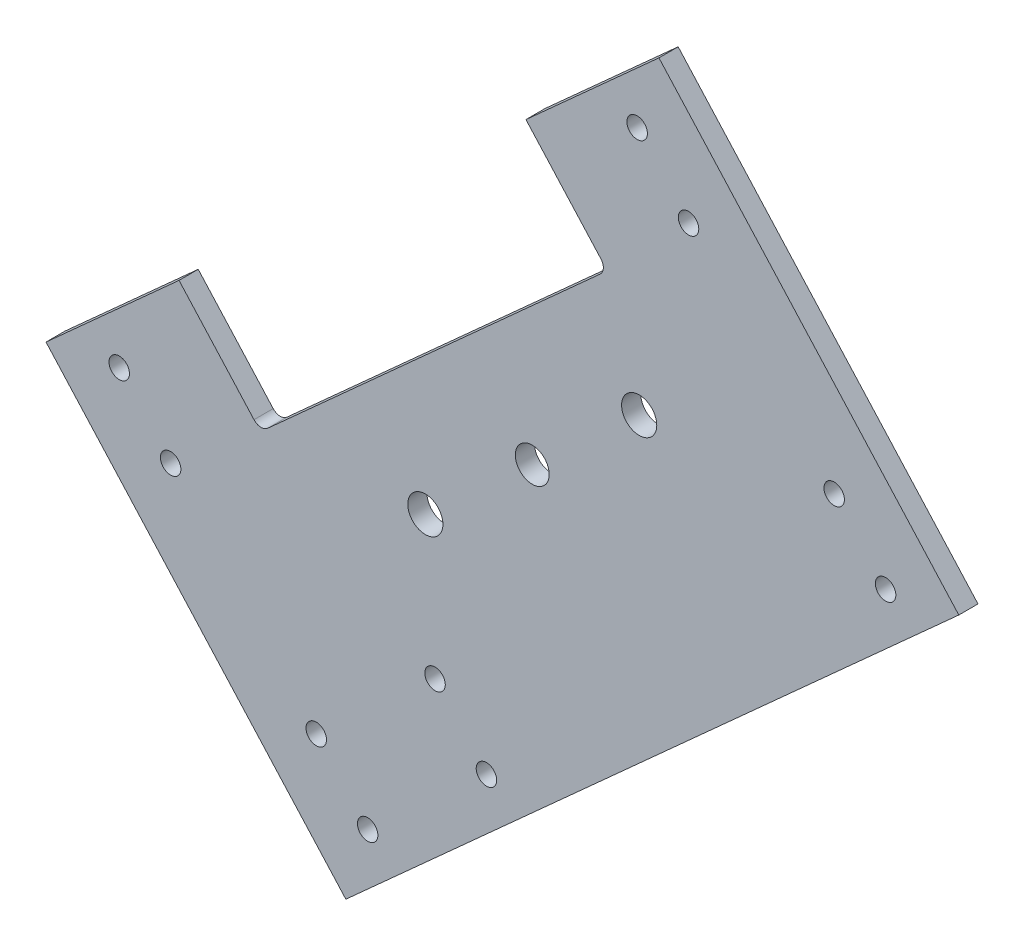
ISO-10303-21;
HEADER;
FILE_DESCRIPTION(('STEP AP214'),'2;1');
FILE_NAME('part.step','',(''),(''),'','','');
FILE_SCHEMA(('AUTOMOTIVE_DESIGN { 1 0 10303 214 1 1 1 1 }'));
ENDSEC;
DATA;
#1=APPLICATION_CONTEXT('core data for automotive mechanical design processes');
#2=APPLICATION_PROTOCOL_DEFINITION('international standard','automotive_design',2000,#1);
#3=PRODUCT_CONTEXT('',#1,'mechanical');
#4=PRODUCT('Part','Part','',(#3));
#5=PRODUCT_RELATED_PRODUCT_CATEGORY('part','',(#4));
#6=PRODUCT_DEFINITION_FORMATION('','',#4);
#7=PRODUCT_DEFINITION_CONTEXT('part definition',#1,'design');
#8=PRODUCT_DEFINITION('design','',#6,#7);
#9=PRODUCT_DEFINITION_SHAPE('','',#8);
#10=(LENGTH_UNIT() NAMED_UNIT(*) SI_UNIT(.MILLI.,.METRE.));
#11=(NAMED_UNIT(*) PLANE_ANGLE_UNIT() SI_UNIT($,.RADIAN.));
#12=(NAMED_UNIT(*) SI_UNIT($,.STERADIAN.) SOLID_ANGLE_UNIT());
#13=UNCERTAINTY_MEASURE_WITH_UNIT(LENGTH_MEASURE(1.E-05),#10,'distance_accuracy_value','');
#14=(GEOMETRIC_REPRESENTATION_CONTEXT(3) GLOBAL_UNCERTAINTY_ASSIGNED_CONTEXT((#13)) GLOBAL_UNIT_ASSIGNED_CONTEXT((#10,
#11,#12)) REPRESENTATION_CONTEXT('',''));
#15=CARTESIAN_POINT('',(0.,0.,0.));
#16=DIRECTION('',(0.,0.,1.));
#17=DIRECTION('',(1.,0.,0.));
#18=AXIS2_PLACEMENT_3D('',#15,#16,#17);
#19=CARTESIAN_POINT('',(59.4886804559392,-390.039209499829,3.));
#20=DIRECTION('',(0.669590345856137,-0.742730616533517,0.));
#21=DIRECTION('',(0.742730616533517,0.669590345856137,0.));
#22=AXIS2_PLACEMENT_3D('',#19,#20,#21);
#23=PLANE('',#22);
#24=DIRECTION('',(-0.742730616533517,-0.669590345856137,0.));
#25=VECTOR('',#24,1.);
#26=CARTESIAN_POINT('',(59.4886804559392,-390.039209499829,3.));
#27=LINE('',#26,#25);
#28=CARTESIAN_POINT('',(80.2851377188777,-371.290679815857,3.));
#29=VERTEX_POINT('',#28);
#30=CARTESIAN_POINT('',(59.4886804559392,-390.039209499829,3.));
#31=VERTEX_POINT('',#30);
#32=EDGE_CURVE('E88',#29,#31,#27,.T.);
#33=ORIENTED_EDGE('',*,*,#32,.F.);
#34=DIRECTION('',(0.,0.,1.));
#35=VECTOR('',#34,1.);
#36=CARTESIAN_POINT('',(80.2851377188777,-371.290679815857,0.));
#37=LINE('',#36,#35);
#38=CARTESIAN_POINT('',(80.2851377188777,-371.290679815857,0.));
#39=VERTEX_POINT('',#38);
#40=EDGE_CURVE('E168',#39,#29,#37,.T.);
#41=ORIENTED_EDGE('',*,*,#40,.F.);
#42=DIRECTION('',(-0.742730616533517,-0.669590345856137,0.));
#43=VECTOR('',#42,1.);
#44=CARTESIAN_POINT('',(59.4886804559392,-390.039209499829,0.));
#45=LINE('',#44,#43);
#46=CARTESIAN_POINT('',(59.4886804559392,-390.039209499829,0.));
#47=VERTEX_POINT('',#46);
#48=EDGE_CURVE('E144',#39,#47,#45,.T.);
#49=ORIENTED_EDGE('',*,*,#48,.T.);
#50=DIRECTION('',(0.,0.,-1.));
#51=VECTOR('',#50,1.);
#52=CARTESIAN_POINT('',(59.4886804559392,-390.039209499829,3.));
#53=LINE('',#52,#51);
#54=EDGE_CURVE('E11',#31,#47,#53,.T.);
#55=ORIENTED_EDGE('',*,*,#54,.F.);
#56=EDGE_LOOP('',(#33,#41,#49,#55));
#57=FACE_BOUND('',#56,.T.);
#58=ADVANCED_FACE('F35',(#57),#23,.F.);
#59=CARTESIAN_POINT('',(155.305831868034,-303.657635716841,0.));
#60=VERTEX_POINT('',#59);
#61=CARTESIAN_POINT('',(134.509374605096,-322.406165400813,0.));
#62=VERTEX_POINT('',#61);
#63=EDGE_CURVE('E251',#60,#62,#45,.T.);
#64=ORIENTED_EDGE('',*,*,#63,.T.);
#65=DIRECTION('',(0.,0.,1.));
#66=VECTOR('',#65,1.);
#67=CARTESIAN_POINT('',(134.509374605096,-322.406165400813,0.));
#68=LINE('',#67,#66);
#69=CARTESIAN_POINT('',(134.509374605096,-322.406165400813,3.));
#70=VERTEX_POINT('',#69);
#71=EDGE_CURVE('E171',#62,#70,#68,.T.);
#72=ORIENTED_EDGE('',*,*,#71,.T.);
#73=CARTESIAN_POINT('',(155.305831868034,-303.657635716841,3.));
#74=VERTEX_POINT('',#73);
#75=EDGE_CURVE('E243',#74,#70,#27,.T.);
#76=ORIENTED_EDGE('',*,*,#75,.F.);
#77=DIRECTION('',(0.,0.,-1.));
#78=VECTOR('',#77,1.);
#79=CARTESIAN_POINT('',(155.305831868034,-303.657635716841,3.));
#80=LINE('',#79,#78);
#81=EDGE_CURVE('E250',#74,#60,#80,.T.);
#82=ORIENTED_EDGE('',*,*,#81,.T.);
#83=EDGE_LOOP('',(#64,#72,#76,#82));
#84=FACE_BOUND('',#83,.T.);
#85=ADVANCED_FACE('F37',(#84),#23,.F.);
#86=CARTESIAN_POINT('',(106.360004665869,-442.030352657175,3.));
#87=DIRECTION('',(0.742730616533512,0.669590345856143,0.));
#88=DIRECTION('',(-0.669590345856143,0.742730616533512,0.));
#89=AXIS2_PLACEMENT_3D('',#86,#87,#88);
#90=PLANE('',#89);
#91=DIRECTION('',(0.669590345856143,-0.742730616533512,0.));
#92=VECTOR('',#91,1.);
#93=CARTESIAN_POINT('',(106.360004665869,-442.030352657175,0.));
#94=LINE('',#93,#92);
#95=CARTESIAN_POINT('',(106.360004665869,-442.030352657175,0.));
#96=VERTEX_POINT('',#95);
#97=EDGE_CURVE('E254',#47,#96,#94,.T.);
#98=ORIENTED_EDGE('',*,*,#97,.T.);
#99=DIRECTION('',(0.,0.,-1.));
#100=VECTOR('',#99,1.);
#101=CARTESIAN_POINT('',(106.360004665869,-442.030352657175,3.));
#102=LINE('',#101,#100);
#103=CARTESIAN_POINT('',(106.360004665869,-442.030352657175,3.));
#104=VERTEX_POINT('',#103);
#105=EDGE_CURVE('E44',#104,#96,#102,.T.);
#106=ORIENTED_EDGE('',*,*,#105,.F.);
#107=DIRECTION('',(0.669590345856143,-0.742730616533512,0.));
#108=VECTOR('',#107,1.);
#109=CARTESIAN_POINT('',(106.360004665869,-442.030352657175,3.));
#110=LINE('',#109,#108);
#111=EDGE_CURVE('E245',#31,#104,#110,.T.);
#112=ORIENTED_EDGE('',*,*,#111,.F.);
#113=ORIENTED_EDGE('',*,*,#54,.T.);
#114=EDGE_LOOP('',(#98,#106,#112,#113));
#115=FACE_BOUND('',#114,.T.);
#116=ADVANCED_FACE('F284',(#115),#90,.F.);
#117=CARTESIAN_POINT('',(202.177156077964,-355.648778874187,3.));
#118=DIRECTION('',(-0.669590345856137,0.742730616533518,0.));
#119=DIRECTION('',(-0.742730616533518,-0.669590345856137,0.));
#120=AXIS2_PLACEMENT_3D('',#117,#118,#119);
#121=PLANE('',#120);
#122=DIRECTION('',(0.742730616533518,0.669590345856137,0.));
#123=VECTOR('',#122,1.);
#124=CARTESIAN_POINT('',(202.177156077964,-355.648778874187,0.));
#125=LINE('',#124,#123);
#126=CARTESIAN_POINT('',(202.177156077964,-355.648778874187,0.));
#127=VERTEX_POINT('',#126);
#128=EDGE_CURVE('E256',#96,#127,#125,.T.);
#129=ORIENTED_EDGE('',*,*,#128,.T.);
#130=DIRECTION('',(0.,0.,-1.));
#131=VECTOR('',#130,1.);
#132=CARTESIAN_POINT('',(202.177156077964,-355.648778874187,3.));
#133=LINE('',#132,#131);
#134=CARTESIAN_POINT('',(202.177156077964,-355.648778874187,3.));
#135=VERTEX_POINT('',#134);
#136=EDGE_CURVE('E260',#135,#127,#133,.T.);
#137=ORIENTED_EDGE('',*,*,#136,.F.);
#138=DIRECTION('',(0.742730616533518,0.669590345856137,0.));
#139=VECTOR('',#138,1.);
#140=CARTESIAN_POINT('',(202.177156077964,-355.648778874187,3.));
#141=LINE('',#140,#139);
#142=EDGE_CURVE('E247',#104,#135,#141,.T.);
#143=ORIENTED_EDGE('',*,*,#142,.F.);
#144=ORIENTED_EDGE('',*,*,#105,.T.);
#145=EDGE_LOOP('',(#129,#137,#143,#144));
#146=FACE_BOUND('',#145,.T.);
#147=ADVANCED_FACE('F267',(#146),#121,.F.);
#148=CARTESIAN_POINT('',(155.305831868034,-303.657635716841,3.));
#149=DIRECTION('',(-0.742730616533512,-0.669590345856143,0.));
#150=DIRECTION('',(0.669590345856143,-0.742730616533512,0.));
#151=AXIS2_PLACEMENT_3D('',#148,#149,#150);
#152=PLANE('',#151);
#153=DIRECTION('',(-0.669590345856143,0.742730616533512,0.));
#154=VECTOR('',#153,1.);
#155=CARTESIAN_POINT('',(155.305831868034,-303.657635716841,0.));
#156=LINE('',#155,#154);
#157=EDGE_CURVE('E81',#127,#60,#156,.T.);
#158=ORIENTED_EDGE('',*,*,#157,.T.);
#159=ORIENTED_EDGE('',*,*,#81,.F.);
#160=DIRECTION('',(-0.669590345856143,0.742730616533512,0.));
#161=VECTOR('',#160,1.);
#162=CARTESIAN_POINT('',(155.305831868034,-303.657635716841,3.));
#163=LINE('',#162,#161);
#164=EDGE_CURVE('E60',#135,#74,#163,.T.);
#165=ORIENTED_EDGE('',*,*,#164,.F.);
#166=ORIENTED_EDGE('',*,*,#136,.T.);
#167=EDGE_LOOP('',(#158,#159,#165,#166));
#168=FACE_BOUND('',#167,.T.);
#169=ADVANCED_FACE('F274',(#168),#152,.F.);
#170=CARTESIAN_POINT('',(0.,0.,3.));
#171=DIRECTION('',(0.,0.,-1.));
#172=DIRECTION('',(-1.,0.,0.));
#173=AXIS2_PLACEMENT_3D('',#170,#171,#172);
#174=PLANE('',#173);
#175=CARTESIAN_POINT('',(151.896067777836,-314.809922874602,3.));
#176=DIRECTION('',(0.,0.,1.));
#177=DIRECTION('',(1.,0.,0.));
#178=AXIS2_PLACEMENT_3D('',#175,#176,#177);
#179=CIRCLE('',#178,1.60000000001453);
#180=CARTESIAN_POINT('',(153.49606777785,-314.809922874602,3.));
#181=VERTEX_POINT('',#180);
#182=EDGE_CURVE('E194',#181,#181,#179,.T.);
#183=ORIENTED_EDGE('',*,*,#182,.F.);
#184=EDGE_LOOP('',(#183));
#185=FACE_BOUND('',#184,.T.);
#186=CARTESIAN_POINT('',(109.769768756069,-430.878065499412,3.));
#187=DIRECTION('',(0.,0.,1.));
#188=DIRECTION('',(1.,0.,0.));
#189=AXIS2_PLACEMENT_3D('',#186,#187,#188);
#190=CIRCLE('',#189,1.60000000013352);
#191=CARTESIAN_POINT('',(111.369768756202,-430.878065499412,3.));
#192=VERTEX_POINT('',#191);
#193=EDGE_CURVE('E183',#192,#192,#190,.T.);
#194=ORIENTED_EDGE('',*,*,#193,.F.);
#195=EDGE_LOOP('',(#194));
#196=FACE_BOUND('',#195,.T.);
#197=CARTESIAN_POINT('',(152.21115635042,-353.570974449494,3.));
#198=DIRECTION('',(0.,0.,1.));
#199=DIRECTION('',(1.,0.,0.));
#200=AXIS2_PLACEMENT_3D('',#197,#198,#199);
#201=CIRCLE('',#200,2.75000000000001);
#202=CARTESIAN_POINT('',(154.96115635042,-353.570974449494,3.));
#203=VERTEX_POINT('',#202);
#204=EDGE_CURVE('E170',#203,#203,#201,.T.);
#205=ORIENTED_EDGE('',*,*,#204,.F.);
#206=EDGE_LOOP('',(#205));
#207=FACE_BOUND('',#206,.T.);
#208=CARTESIAN_POINT('',(118.788278606412,-383.70254001302,3.));
#209=DIRECTION('',(0.,0.,1.));
#210=DIRECTION('',(1.,0.,0.));
#211=AXIS2_PLACEMENT_3D('',#208,#209,#210);
#212=CIRCLE('',#211,2.75000000000001);
#213=CARTESIAN_POINT('',(121.538278606412,-383.70254001302,3.));
#214=VERTEX_POINT('',#213);
#215=EDGE_CURVE('E150',#214,#214,#212,.T.);
#216=ORIENTED_EDGE('',*,*,#215,.F.);
#217=EDGE_LOOP('',(#216));
#218=FACE_BOUND('',#217,.T.);
#219=CARTESIAN_POINT('',(101.734684605795,-421.965298101009,3.));
#220=DIRECTION('',(0.,0.,1.));
#221=DIRECTION('',(1.,0.,0.));
#222=AXIS2_PLACEMENT_3D('',#219,#220,#221);
#223=CIRCLE('',#222,1.60000000013351);
#224=CARTESIAN_POINT('',(103.334684605928,-421.965298101009,3.));
#225=VERTEX_POINT('',#224);
#226=EDGE_CURVE('E182',#225,#225,#223,.T.);
#227=ORIENTED_EDGE('',*,*,#226,.F.);
#228=EDGE_LOOP('',(#227));
#229=FACE_BOUND('',#228,.T.);
#230=CARTESIAN_POINT('',(128.338034169404,-414.13830685301,3.));
#231=DIRECTION('',(0.,0.,1.));
#232=DIRECTION('',(1.,0.,0.));
#233=AXIS2_PLACEMENT_3D('',#230,#231,#232);
#234=CIRCLE('',#233,1.5999999998559);
#235=CARTESIAN_POINT('',(129.93803416926,-414.13830685301,3.));
#236=VERTEX_POINT('',#235);
#237=EDGE_CURVE('E231',#236,#236,#234,.T.);
#238=ORIENTED_EDGE('',*,*,#237,.F.);
#239=EDGE_LOOP('',(#238));
#240=FACE_BOUND('',#239,.T.);
#241=CARTESIAN_POINT('',(120.30295001913,-405.225539454608,3.));
#242=DIRECTION('',(0.,0.,1.));
#243=DIRECTION('',(1.,0.,0.));
#244=AXIS2_PLACEMENT_3D('',#241,#242,#243);
#245=CIRCLE('',#244,1.59999999985592);
#246=CARTESIAN_POINT('',(121.902950018986,-405.225539454608,3.));
#247=VERTEX_POINT('',#246);
#248=EDGE_CURVE('E225',#247,#247,#245,.T.);
#249=ORIENTED_EDGE('',*,*,#248,.F.);
#250=EDGE_LOOP('',(#249));
#251=FACE_BOUND('',#250,.T.);
#252=CARTESIAN_POINT('',(78.968612846686,-396.71245713887,3.));
#253=DIRECTION('',(0.,0.,1.));
#254=DIRECTION('',(1.,0.,0.));
#255=AXIS2_PLACEMENT_3D('',#252,#253,#254);
#256=CIRCLE('',#255,1.60000000011858);
#257=CARTESIAN_POINT('',(80.5686128468046,-396.71245713887,3.));
#258=VERTEX_POINT('',#257);
#259=EDGE_CURVE('E219',#258,#258,#256,.T.);
#260=ORIENTED_EDGE('',*,*,#259,.F.);
#261=EDGE_LOOP('',(#260));
#262=FACE_BOUND('',#261,.T.);
#263=CARTESIAN_POINT('',(70.9335286964123,-387.799689740468,3.));
#264=DIRECTION('',(0.,0.,1.));
#265=DIRECTION('',(1.,0.,0.));
#266=AXIS2_PLACEMENT_3D('',#263,#264,#265);
#267=CIRCLE('',#266,1.60000000011862);
#268=CARTESIAN_POINT('',(72.5335286965309,-387.799689740468,3.));
#269=VERTEX_POINT('',#268);
#270=EDGE_CURVE('E213',#269,#269,#267,.T.);
#271=ORIENTED_EDGE('',*,*,#270,.F.);
#272=EDGE_LOOP('',(#271));
#273=FACE_BOUND('',#272,.T.);
#274=CARTESIAN_POINT('',(190.732307837492,-357.888298633546,3.));
#275=DIRECTION('',(0.,0.,1.));
#276=DIRECTION('',(1.,0.,0.));
#277=AXIS2_PLACEMENT_3D('',#274,#275,#276);
#278=CIRCLE('',#277,1.60000000002582);
#279=CARTESIAN_POINT('',(192.332307837518,-357.888298633546,3.));
#280=VERTEX_POINT('',#279);
#281=EDGE_CURVE('E207',#280,#280,#278,.T.);
#282=ORIENTED_EDGE('',*,*,#281,.F.);
#283=EDGE_LOOP('',(#282));
#284=FACE_BOUND('',#283,.T.);
#285=CARTESIAN_POINT('',(182.697223687218,-348.975531235144,3.));
#286=DIRECTION('',(0.,0.,1.));
#287=DIRECTION('',(1.,0.,0.));
#288=AXIS2_PLACEMENT_3D('',#285,#286,#287);
#289=CIRCLE('',#288,1.60000000002582);
#290=CARTESIAN_POINT('',(184.297223687244,-348.975531235144,3.));
#291=VERTEX_POINT('',#290);
#292=EDGE_CURVE('E201',#291,#291,#289,.T.);
#293=ORIENTED_EDGE('',*,*,#292,.F.);
#294=EDGE_LOOP('',(#293));
#295=FACE_BOUND('',#294,.T.);
#296=CARTESIAN_POINT('',(159.93115192811,-323.722690273004,3.));
#297=DIRECTION('',(0.,0.,1.));
#298=DIRECTION('',(1.,0.,0.));
#299=AXIS2_PLACEMENT_3D('',#296,#297,#298);
#300=CIRCLE('',#299,1.60000000001457);
#301=CARTESIAN_POINT('',(161.531151928124,-323.722690273004,3.));
#302=VERTEX_POINT('',#301);
#303=EDGE_CURVE('E195',#302,#302,#300,.T.);
#304=ORIENTED_EDGE('',*,*,#303,.F.);
#305=EDGE_LOOP('',(#304));
#306=FACE_BOUND('',#305,.T.);
#307=CARTESIAN_POINT('',(135.499717478417,-368.636757231257,3.));
#308=DIRECTION('',(0.,0.,1.));
#309=DIRECTION('',(1.,0.,0.));
#310=AXIS2_PLACEMENT_3D('',#307,#308,#309);
#311=CIRCLE('',#310,2.65000000000002);
#312=CARTESIAN_POINT('',(138.149717478417,-368.636757231257,3.));
#313=VERTEX_POINT('',#312);
#314=EDGE_CURVE('E239',#313,#313,#311,.T.);
#315=ORIENTED_EDGE('',*,*,#314,.F.);
#316=EDGE_LOOP('',(#315));
#317=FACE_BOUND('',#316,.T.);
#318=CARTESIAN_POINT('',(93.1170646961605,-383.284080086409,3.));
#319=DIRECTION('',(0.,0.,1.));
#320=DIRECTION('',(1.,0.,0.));
#321=AXIS2_PLACEMENT_3D('',#318,#319,#320);
#322=CIRCLE('',#321,1.50000000000003);
#323=CARTESIAN_POINT('',(92.0029687713602,-384.288465605194,3.));
#324=VERTEX_POINT('',#323);
#325=CARTESIAN_POINT('',(94.1214502149448,-384.39817601121,3.));
#326=VERTEX_POINT('',#325);
#327=EDGE_CURVE('E160',#324,#326,#322,.T.);
#328=ORIENTED_EDGE('',*,*,#327,.F.);
#329=DIRECTION('',(0.669590345856143,-0.742730616533512,0.));
#330=VECTOR('',#329,1.);
#331=CARTESIAN_POINT('',(80.2851377188777,-371.290679815857,3.));
#332=LINE('',#331,#330);
#333=EDGE_CURVE('E128',#29,#324,#332,.T.);
#334=ORIENTED_EDGE('',*,*,#333,.F.);
#335=ORIENTED_EDGE('',*,*,#32,.T.);
#336=ORIENTED_EDGE('',*,*,#111,.T.);
#337=ORIENTED_EDGE('',*,*,#142,.T.);
#338=ORIENTED_EDGE('',*,*,#164,.T.);
#339=ORIENTED_EDGE('',*,*,#75,.T.);
#340=DIRECTION('',(-0.669590345856144,0.742730616533511,0.));
#341=VECTOR('',#340,1.);
#342=CARTESIAN_POINT('',(134.509374605096,-322.406165400813,3.));
#343=LINE('',#342,#341);
#344=CARTESIAN_POINT('',(146.227205657578,-335.403951190148,3.));
#345=VERTEX_POINT('',#344);
#346=EDGE_CURVE('E145',#345,#70,#343,.T.);
#347=ORIENTED_EDGE('',*,*,#346,.F.);
#348=CARTESIAN_POINT('',(145.113109732778,-336.408336708933,3.));
#349=DIRECTION('',(0.,0.,1.));
#350=DIRECTION('',(-1.,0.,0.));
#351=AXIS2_PLACEMENT_3D('',#348,#349,#350);
#352=CIRCLE('',#351,1.50000000000002);
#353=CARTESIAN_POINT('',(146.117495251562,-337.522432633733,3.));
#354=VERTEX_POINT('',#353);
#355=EDGE_CURVE('E147',#354,#345,#352,.T.);
#356=ORIENTED_EDGE('',*,*,#355,.F.);
#357=DIRECTION('',(0.742730616533512,0.669590345856143,0.));
#358=VECTOR('',#357,1.);
#359=CARTESIAN_POINT('',(94.1214502149448,-384.39817601121,3.));
#360=LINE('',#359,#358);
#361=EDGE_CURVE('E163',#326,#354,#360,.T.);
#362=ORIENTED_EDGE('',*,*,#361,.F.);
#363=EDGE_LOOP('',(#328,#334,#335,#336,#337,#338,#339,#347,#356,#362));
#364=FACE_BOUND('',#363,.T.);
#365=ADVANCED_FACE('F276',(#185,#196,#207,#218,#229,#240,#251,#262,#273,#284,#295,#306,#317,
#364),#174,.F.);
#366=CARTESIAN_POINT('',(0.,0.,0.));
#367=DIRECTION('',(0.,0.,-1.));
#368=DIRECTION('',(-1.,0.,0.));
#369=AXIS2_PLACEMENT_3D('',#366,#367,#368);
#370=PLANE('',#369);
#371=CARTESIAN_POINT('',(151.896067777836,-314.809922874602,0.));
#372=DIRECTION('',(0.,0.,1.));
#373=DIRECTION('',(1.,0.,0.));
#374=AXIS2_PLACEMENT_3D('',#371,#372,#373);
#375=CIRCLE('',#374,1.60000000001453);
#376=CARTESIAN_POINT('',(153.49606777785,-314.809922874602,0.));
#377=VERTEX_POINT('',#376);
#378=EDGE_CURVE('E242',#377,#377,#375,.T.);
#379=ORIENTED_EDGE('',*,*,#378,.T.);
#380=EDGE_LOOP('',(#379));
#381=FACE_BOUND('',#380,.T.);
#382=CARTESIAN_POINT('',(109.769768756069,-430.878065499412,0.));
#383=DIRECTION('',(0.,0.,1.));
#384=DIRECTION('',(1.,0.,0.));
#385=AXIS2_PLACEMENT_3D('',#382,#383,#384);
#386=CIRCLE('',#385,1.60000000013352);
#387=CARTESIAN_POINT('',(111.369768756202,-430.878065499412,0.));
#388=VERTEX_POINT('',#387);
#389=EDGE_CURVE('E179',#388,#388,#386,.T.);
#390=ORIENTED_EDGE('',*,*,#389,.T.);
#391=EDGE_LOOP('',(#390));
#392=FACE_BOUND('',#391,.T.);
#393=CARTESIAN_POINT('',(152.21115635042,-353.570974449494,0.));
#394=DIRECTION('',(0.,0.,1.));
#395=DIRECTION('',(1.,0.,0.));
#396=AXIS2_PLACEMENT_3D('',#393,#394,#395);
#397=CIRCLE('',#396,2.75000000000001);
#398=CARTESIAN_POINT('',(154.96115635042,-353.570974449494,0.));
#399=VERTEX_POINT('',#398);
#400=EDGE_CURVE('E186',#399,#399,#397,.T.);
#401=ORIENTED_EDGE('',*,*,#400,.T.);
#402=EDGE_LOOP('',(#401));
#403=FACE_BOUND('',#402,.T.);
#404=CARTESIAN_POINT('',(118.788278606412,-383.70254001302,0.));
#405=DIRECTION('',(0.,0.,1.));
#406=DIRECTION('',(1.,0.,0.));
#407=AXIS2_PLACEMENT_3D('',#404,#405,#406);
#408=CIRCLE('',#407,2.75000000000001);
#409=CARTESIAN_POINT('',(121.538278606412,-383.70254001302,0.));
#410=VERTEX_POINT('',#409);
#411=EDGE_CURVE('E161',#410,#410,#408,.T.);
#412=ORIENTED_EDGE('',*,*,#411,.T.);
#413=EDGE_LOOP('',(#412));
#414=FACE_BOUND('',#413,.T.);
#415=DIRECTION('',(0.669590345856143,-0.742730616533512,0.));
#416=VECTOR('',#415,1.);
#417=CARTESIAN_POINT('',(80.2851377188777,-371.290679815857,0.));
#418=LINE('',#417,#416);
#419=CARTESIAN_POINT('',(92.0029687713602,-384.288465605194,0.));
#420=VERTEX_POINT('',#419);
#421=EDGE_CURVE('E126',#39,#420,#418,.T.);
#422=ORIENTED_EDGE('',*,*,#421,.T.);
#423=CARTESIAN_POINT('',(93.1170646961605,-383.284080086409,0.));
#424=DIRECTION('',(0.,0.,1.));
#425=DIRECTION('',(1.,0.,0.));
#426=AXIS2_PLACEMENT_3D('',#423,#424,#425);
#427=CIRCLE('',#426,1.50000000000003);
#428=CARTESIAN_POINT('',(94.1214502149448,-384.39817601121,0.));
#429=VERTEX_POINT('',#428);
#430=EDGE_CURVE('E136',#420,#429,#427,.T.);
#431=ORIENTED_EDGE('',*,*,#430,.T.);
#432=DIRECTION('',(0.742730616533512,0.669590345856143,0.));
#433=VECTOR('',#432,1.);
#434=CARTESIAN_POINT('',(94.1214502149448,-384.39817601121,0.));
#435=LINE('',#434,#433);
#436=CARTESIAN_POINT('',(146.117495251562,-337.522432633733,0.));
#437=VERTEX_POINT('',#436);
#438=EDGE_CURVE('E51',#429,#437,#435,.T.);
#439=ORIENTED_EDGE('',*,*,#438,.T.);
#440=CARTESIAN_POINT('',(145.113109732778,-336.408336708933,0.));
#441=DIRECTION('',(0.,0.,1.));
#442=DIRECTION('',(-1.,0.,0.));
#443=AXIS2_PLACEMENT_3D('',#440,#441,#442);
#444=CIRCLE('',#443,1.50000000000002);
#445=CARTESIAN_POINT('',(146.227205657578,-335.403951190148,0.));
#446=VERTEX_POINT('',#445);
#447=EDGE_CURVE('E154',#437,#446,#444,.T.);
#448=ORIENTED_EDGE('',*,*,#447,.T.);
#449=DIRECTION('',(-0.669590345856144,0.742730616533511,0.));
#450=VECTOR('',#449,1.);
#451=CARTESIAN_POINT('',(134.509374605096,-322.406165400813,0.));
#452=LINE('',#451,#450);
#453=EDGE_CURVE('E133',#446,#62,#452,.T.);
#454=ORIENTED_EDGE('',*,*,#453,.T.);
#455=ORIENTED_EDGE('',*,*,#63,.F.);
#456=ORIENTED_EDGE('',*,*,#157,.F.);
#457=ORIENTED_EDGE('',*,*,#128,.F.);
#458=ORIENTED_EDGE('',*,*,#97,.F.);
#459=ORIENTED_EDGE('',*,*,#48,.F.);
#460=EDGE_LOOP('',(#422,#431,#439,#448,#454,#455,#456,#457,#458,#459));
#461=FACE_BOUND('',#460,.T.);
#462=CARTESIAN_POINT('',(101.734684605795,-421.965298101009,0.));
#463=DIRECTION('',(0.,0.,1.));
#464=DIRECTION('',(1.,0.,0.));
#465=AXIS2_PLACEMENT_3D('',#462,#463,#464);
#466=CIRCLE('',#465,1.60000000013351);
#467=CARTESIAN_POINT('',(103.334684605928,-421.965298101009,0.));
#468=VERTEX_POINT('',#467);
#469=EDGE_CURVE('E234',#468,#468,#466,.T.);
#470=ORIENTED_EDGE('',*,*,#469,.T.);
#471=EDGE_LOOP('',(#470));
#472=FACE_BOUND('',#471,.T.);
#473=CARTESIAN_POINT('',(128.338034169404,-414.13830685301,0.));
#474=DIRECTION('',(0.,0.,1.));
#475=DIRECTION('',(1.,0.,0.));
#476=AXIS2_PLACEMENT_3D('',#473,#474,#475);
#477=CIRCLE('',#476,1.5999999998559);
#478=CARTESIAN_POINT('',(129.93803416926,-414.13830685301,0.));
#479=VERTEX_POINT('',#478);
#480=EDGE_CURVE('E228',#479,#479,#477,.T.);
#481=ORIENTED_EDGE('',*,*,#480,.T.);
#482=EDGE_LOOP('',(#481));
#483=FACE_BOUND('',#482,.T.);
#484=CARTESIAN_POINT('',(120.30295001913,-405.225539454608,0.));
#485=DIRECTION('',(0.,0.,1.));
#486=DIRECTION('',(1.,0.,0.));
#487=AXIS2_PLACEMENT_3D('',#484,#485,#486);
#488=CIRCLE('',#487,1.59999999985592);
#489=CARTESIAN_POINT('',(121.902950018986,-405.225539454608,0.));
#490=VERTEX_POINT('',#489);
#491=EDGE_CURVE('E222',#490,#490,#488,.T.);
#492=ORIENTED_EDGE('',*,*,#491,.T.);
#493=EDGE_LOOP('',(#492));
#494=FACE_BOUND('',#493,.T.);
#495=CARTESIAN_POINT('',(78.968612846686,-396.71245713887,0.));
#496=DIRECTION('',(0.,0.,1.));
#497=DIRECTION('',(1.,0.,0.));
#498=AXIS2_PLACEMENT_3D('',#495,#496,#497);
#499=CIRCLE('',#498,1.60000000011858);
#500=CARTESIAN_POINT('',(80.5686128468046,-396.71245713887,0.));
#501=VERTEX_POINT('',#500);
#502=EDGE_CURVE('E216',#501,#501,#499,.T.);
#503=ORIENTED_EDGE('',*,*,#502,.T.);
#504=EDGE_LOOP('',(#503));
#505=FACE_BOUND('',#504,.T.);
#506=CARTESIAN_POINT('',(70.9335286964123,-387.799689740468,0.));
#507=DIRECTION('',(0.,0.,1.));
#508=DIRECTION('',(1.,0.,0.));
#509=AXIS2_PLACEMENT_3D('',#506,#507,#508);
#510=CIRCLE('',#509,1.60000000011862);
#511=CARTESIAN_POINT('',(72.5335286965309,-387.799689740468,0.));
#512=VERTEX_POINT('',#511);
#513=EDGE_CURVE('E210',#512,#512,#510,.T.);
#514=ORIENTED_EDGE('',*,*,#513,.T.);
#515=EDGE_LOOP('',(#514));
#516=FACE_BOUND('',#515,.T.);
#517=CARTESIAN_POINT('',(190.732307837492,-357.888298633546,0.));
#518=DIRECTION('',(0.,0.,1.));
#519=DIRECTION('',(1.,0.,0.));
#520=AXIS2_PLACEMENT_3D('',#517,#518,#519);
#521=CIRCLE('',#520,1.60000000002582);
#522=CARTESIAN_POINT('',(192.332307837518,-357.888298633546,0.));
#523=VERTEX_POINT('',#522);
#524=EDGE_CURVE('E204',#523,#523,#521,.T.);
#525=ORIENTED_EDGE('',*,*,#524,.T.);
#526=EDGE_LOOP('',(#525));
#527=FACE_BOUND('',#526,.T.);
#528=CARTESIAN_POINT('',(182.697223687218,-348.975531235144,0.));
#529=DIRECTION('',(0.,0.,1.));
#530=DIRECTION('',(1.,0.,0.));
#531=AXIS2_PLACEMENT_3D('',#528,#529,#530);
#532=CIRCLE('',#531,1.60000000002582);
#533=CARTESIAN_POINT('',(184.297223687244,-348.975531235144,0.));
#534=VERTEX_POINT('',#533);
#535=EDGE_CURVE('E198',#534,#534,#532,.T.);
#536=ORIENTED_EDGE('',*,*,#535,.T.);
#537=EDGE_LOOP('',(#536));
#538=FACE_BOUND('',#537,.T.);
#539=CARTESIAN_POINT('',(159.93115192811,-323.722690273004,0.));
#540=DIRECTION('',(0.,0.,1.));
#541=DIRECTION('',(1.,0.,0.));
#542=AXIS2_PLACEMENT_3D('',#539,#540,#541);
#543=CIRCLE('',#542,1.60000000001457);
#544=CARTESIAN_POINT('',(161.531151928124,-323.722690273004,0.));
#545=VERTEX_POINT('',#544);
#546=EDGE_CURVE('E191',#545,#545,#543,.T.);
#547=ORIENTED_EDGE('',*,*,#546,.T.);
#548=EDGE_LOOP('',(#547));
#549=FACE_BOUND('',#548,.T.);
#550=CARTESIAN_POINT('',(135.499717478417,-368.636757231257,0.));
#551=DIRECTION('',(0.,0.,-1.));
#552=DIRECTION('',(-1.,0.,0.));
#553=AXIS2_PLACEMENT_3D('',#550,#551,#552);
#554=CIRCLE('',#553,2.65000000000002);
#555=CARTESIAN_POINT('',(132.849717478417,-368.636757231257,0.));
#556=VERTEX_POINT('',#555);
#557=EDGE_CURVE('E39',#556,#556,#554,.T.);
#558=ORIENTED_EDGE('',*,*,#557,.F.);
#559=EDGE_LOOP('',(#558));
#560=FACE_BOUND('',#559,.T.);
#561=ADVANCED_FACE('F141',(#381,#392,#403,#414,#461,#472,#483,#494,#505,#516,#527,#538,#549,
#560),#370,.T.);
#562=CARTESIAN_POINT('',(135.499717478417,-368.636757231257,-2.));
#563=DIRECTION('',(0.,0.,1.));
#564=DIRECTION('',(1.,0.,0.));
#565=AXIS2_PLACEMENT_3D('',#562,#563,#564);
#566=CYLINDRICAL_SURFACE('',#565,2.65000000000002);
#567=ORIENTED_EDGE('',*,*,#557,.T.);
#568=EDGE_LOOP('',(#567));
#569=FACE_BOUND('',#568,.T.);
#570=ORIENTED_EDGE('',*,*,#314,.T.);
#571=EDGE_LOOP('',(#570));
#572=FACE_BOUND('',#571,.T.);
#573=ADVANCED_FACE('F332',(#569,#572),#566,.F.);
#574=CARTESIAN_POINT('',(159.93115192811,-323.722690273004,0.));
#575=DIRECTION('',(0.,0.,1.));
#576=DIRECTION('',(1.,0.,0.));
#577=AXIS2_PLACEMENT_3D('',#574,#575,#576);
#578=CYLINDRICAL_SURFACE('',#577,1.60000000001457);
#579=ORIENTED_EDGE('',*,*,#546,.F.);
#580=EDGE_LOOP('',(#579));
#581=FACE_BOUND('',#580,.T.);
#582=ORIENTED_EDGE('',*,*,#303,.T.);
#583=EDGE_LOOP('',(#582));
#584=FACE_BOUND('',#583,.T.);
#585=ADVANCED_FACE('F328',(#581,#584),#578,.F.);
#586=CARTESIAN_POINT('',(182.697223687218,-348.975531235144,0.));
#587=DIRECTION('',(0.,0.,1.));
#588=DIRECTION('',(1.,0.,0.));
#589=AXIS2_PLACEMENT_3D('',#586,#587,#588);
#590=CYLINDRICAL_SURFACE('',#589,1.60000000002582);
#591=ORIENTED_EDGE('',*,*,#535,.F.);
#592=EDGE_LOOP('',(#591));
#593=FACE_BOUND('',#592,.T.);
#594=ORIENTED_EDGE('',*,*,#292,.T.);
#595=EDGE_LOOP('',(#594));
#596=FACE_BOUND('',#595,.T.);
#597=ADVANCED_FACE('F331',(#593,#596),#590,.F.);
#598=CARTESIAN_POINT('',(190.732307837492,-357.888298633546,0.));
#599=DIRECTION('',(0.,0.,1.));
#600=DIRECTION('',(1.,0.,0.));
#601=AXIS2_PLACEMENT_3D('',#598,#599,#600);
#602=CYLINDRICAL_SURFACE('',#601,1.60000000002582);
#603=ORIENTED_EDGE('',*,*,#524,.F.);
#604=EDGE_LOOP('',(#603));
#605=FACE_BOUND('',#604,.T.);
#606=ORIENTED_EDGE('',*,*,#281,.T.);
#607=EDGE_LOOP('',(#606));
#608=FACE_BOUND('',#607,.T.);
#609=ADVANCED_FACE('F336',(#605,#608),#602,.F.);
#610=CARTESIAN_POINT('',(70.9335286964123,-387.799689740468,0.));
#611=DIRECTION('',(0.,0.,1.));
#612=DIRECTION('',(1.,0.,0.));
#613=AXIS2_PLACEMENT_3D('',#610,#611,#612);
#614=CYLINDRICAL_SURFACE('',#613,1.60000000011862);
#615=ORIENTED_EDGE('',*,*,#513,.F.);
#616=EDGE_LOOP('',(#615));
#617=FACE_BOUND('',#616,.T.);
#618=ORIENTED_EDGE('',*,*,#270,.T.);
#619=EDGE_LOOP('',(#618));
#620=FACE_BOUND('',#619,.T.);
#621=ADVANCED_FACE('F340',(#617,#620),#614,.F.);
#622=CARTESIAN_POINT('',(78.968612846686,-396.71245713887,0.));
#623=DIRECTION('',(0.,0.,1.));
#624=DIRECTION('',(1.,0.,0.));
#625=AXIS2_PLACEMENT_3D('',#622,#623,#624);
#626=CYLINDRICAL_SURFACE('',#625,1.60000000011858);
#627=ORIENTED_EDGE('',*,*,#502,.F.);
#628=EDGE_LOOP('',(#627));
#629=FACE_BOUND('',#628,.T.);
#630=ORIENTED_EDGE('',*,*,#259,.T.);
#631=EDGE_LOOP('',(#630));
#632=FACE_BOUND('',#631,.T.);
#633=ADVANCED_FACE('F344',(#629,#632),#626,.F.);
#634=CARTESIAN_POINT('',(120.30295001913,-405.225539454608,0.));
#635=DIRECTION('',(0.,0.,1.));
#636=DIRECTION('',(1.,0.,0.));
#637=AXIS2_PLACEMENT_3D('',#634,#635,#636);
#638=CYLINDRICAL_SURFACE('',#637,1.59999999985592);
#639=ORIENTED_EDGE('',*,*,#491,.F.);
#640=EDGE_LOOP('',(#639));
#641=FACE_BOUND('',#640,.T.);
#642=ORIENTED_EDGE('',*,*,#248,.T.);
#643=EDGE_LOOP('',(#642));
#644=FACE_BOUND('',#643,.T.);
#645=ADVANCED_FACE('F348',(#641,#644),#638,.F.);
#646=CARTESIAN_POINT('',(128.338034169404,-414.13830685301,0.));
#647=DIRECTION('',(0.,0.,1.));
#648=DIRECTION('',(1.,0.,0.));
#649=AXIS2_PLACEMENT_3D('',#646,#647,#648);
#650=CYLINDRICAL_SURFACE('',#649,1.5999999998559);
#651=ORIENTED_EDGE('',*,*,#480,.F.);
#652=EDGE_LOOP('',(#651));
#653=FACE_BOUND('',#652,.T.);
#654=ORIENTED_EDGE('',*,*,#237,.T.);
#655=EDGE_LOOP('',(#654));
#656=FACE_BOUND('',#655,.T.);
#657=ADVANCED_FACE('F352',(#653,#656),#650,.F.);
#658=CARTESIAN_POINT('',(101.734684605795,-421.965298101009,0.));
#659=DIRECTION('',(0.,0.,1.));
#660=DIRECTION('',(1.,0.,0.));
#661=AXIS2_PLACEMENT_3D('',#658,#659,#660);
#662=CYLINDRICAL_SURFACE('',#661,1.60000000013351);
#663=ORIENTED_EDGE('',*,*,#469,.F.);
#664=EDGE_LOOP('',(#663));
#665=FACE_BOUND('',#664,.T.);
#666=ORIENTED_EDGE('',*,*,#226,.T.);
#667=EDGE_LOOP('',(#666));
#668=FACE_BOUND('',#667,.T.);
#669=ADVANCED_FACE('F309',(#665,#668),#662,.F.);
#670=CARTESIAN_POINT('',(80.2851377188777,-371.290679815857,0.));
#671=DIRECTION('',(-0.742730616533512,-0.669590345856143,0.));
#672=DIRECTION('',(0.669590345856143,-0.742730616533512,0.));
#673=AXIS2_PLACEMENT_3D('',#670,#671,#672);
#674=PLANE('',#673);
#675=ORIENTED_EDGE('',*,*,#333,.T.);
#676=DIRECTION('',(0.,0.,1.));
#677=VECTOR('',#676,1.);
#678=CARTESIAN_POINT('',(92.0029687713602,-384.288465605194,0.));
#679=LINE('',#678,#677);
#680=EDGE_CURVE('E122',#420,#324,#679,.T.);
#681=ORIENTED_EDGE('',*,*,#680,.F.);
#682=ORIENTED_EDGE('',*,*,#421,.F.);
#683=ORIENTED_EDGE('',*,*,#40,.T.);
#684=EDGE_LOOP('',(#675,#681,#682,#683));
#685=FACE_BOUND('',#684,.T.);
#686=ADVANCED_FACE('F124',(#685),#674,.F.);
#687=CARTESIAN_POINT('',(134.509374605096,-322.406165400813,0.));
#688=DIRECTION('',(0.742730616533511,0.669590345856144,0.));
#689=DIRECTION('',(-0.669590345856144,0.742730616533511,0.));
#690=AXIS2_PLACEMENT_3D('',#687,#688,#689);
#691=PLANE('',#690);
#692=ORIENTED_EDGE('',*,*,#346,.T.);
#693=ORIENTED_EDGE('',*,*,#71,.F.);
#694=ORIENTED_EDGE('',*,*,#453,.F.);
#695=DIRECTION('',(0.,0.,1.));
#696=VECTOR('',#695,1.);
#697=CARTESIAN_POINT('',(146.227205657578,-335.403951190148,0.));
#698=LINE('',#697,#696);
#699=EDGE_CURVE('E174',#446,#345,#698,.T.);
#700=ORIENTED_EDGE('',*,*,#699,.T.);
#701=EDGE_LOOP('',(#692,#693,#694,#700));
#702=FACE_BOUND('',#701,.T.);
#703=ADVANCED_FACE('F301',(#702),#691,.F.);
#704=CARTESIAN_POINT('',(145.113109732778,-336.408336708933,0.));
#705=DIRECTION('',(0.,0.,1.));
#706=DIRECTION('',(1.,0.,0.));
#707=AXIS2_PLACEMENT_3D('',#704,#705,#706);
#708=CYLINDRICAL_SURFACE('',#707,1.50000000000002);
#709=ORIENTED_EDGE('',*,*,#355,.T.);
#710=ORIENTED_EDGE('',*,*,#699,.F.);
#711=ORIENTED_EDGE('',*,*,#447,.F.);
#712=DIRECTION('',(0.,0.,1.));
#713=VECTOR('',#712,1.);
#714=CARTESIAN_POINT('',(146.117495251562,-337.522432633733,0.));
#715=LINE('',#714,#713);
#716=EDGE_CURVE('E176',#437,#354,#715,.T.);
#717=ORIENTED_EDGE('',*,*,#716,.T.);
#718=EDGE_LOOP('',(#709,#710,#711,#717));
#719=FACE_BOUND('',#718,.T.);
#720=ADVANCED_FACE('F299',(#719),#708,.F.);
#721=CARTESIAN_POINT('',(94.1214502149448,-384.39817601121,0.));
#722=DIRECTION('',(0.669590345856143,-0.742730616533512,0.));
#723=DIRECTION('',(0.742730616533512,0.669590345856143,0.));
#724=AXIS2_PLACEMENT_3D('',#721,#722,#723);
#725=PLANE('',#724);
#726=ORIENTED_EDGE('',*,*,#361,.T.);
#727=ORIENTED_EDGE('',*,*,#716,.F.);
#728=ORIENTED_EDGE('',*,*,#438,.F.);
#729=DIRECTION('',(0.,0.,1.));
#730=VECTOR('',#729,1.);
#731=CARTESIAN_POINT('',(94.1214502149448,-384.39817601121,0.));
#732=LINE('',#731,#730);
#733=EDGE_CURVE('E132',#429,#326,#732,.T.);
#734=ORIENTED_EDGE('',*,*,#733,.T.);
#735=EDGE_LOOP('',(#726,#727,#728,#734));
#736=FACE_BOUND('',#735,.T.);
#737=ADVANCED_FACE('F296',(#736),#725,.F.);
#738=CARTESIAN_POINT('',(93.1170646961605,-383.284080086409,0.));
#739=DIRECTION('',(0.,0.,1.));
#740=DIRECTION('',(1.,0.,0.));
#741=AXIS2_PLACEMENT_3D('',#738,#739,#740);
#742=CYLINDRICAL_SURFACE('',#741,1.50000000000003);
#743=ORIENTED_EDGE('',*,*,#327,.T.);
#744=ORIENTED_EDGE('',*,*,#733,.F.);
#745=ORIENTED_EDGE('',*,*,#430,.F.);
#746=ORIENTED_EDGE('',*,*,#680,.T.);
#747=EDGE_LOOP('',(#743,#744,#745,#746));
#748=FACE_BOUND('',#747,.T.);
#749=ADVANCED_FACE('F137',(#748),#742,.F.);
#750=CARTESIAN_POINT('',(118.788278606412,-383.70254001302,0.));
#751=DIRECTION('',(0.,0.,1.));
#752=DIRECTION('',(1.,0.,0.));
#753=AXIS2_PLACEMENT_3D('',#750,#751,#752);
#754=CYLINDRICAL_SURFACE('',#753,2.75000000000001);
#755=ORIENTED_EDGE('',*,*,#215,.T.);
#756=EDGE_LOOP('',(#755));
#757=FACE_BOUND('',#756,.T.);
#758=ORIENTED_EDGE('',*,*,#411,.F.);
#759=EDGE_LOOP('',(#758));
#760=FACE_BOUND('',#759,.T.);
#761=ADVANCED_FACE('F312',(#757,#760),#754,.F.);
#762=CARTESIAN_POINT('',(152.21115635042,-353.570974449494,0.));
#763=DIRECTION('',(0.,0.,1.));
#764=DIRECTION('',(1.,0.,0.));
#765=AXIS2_PLACEMENT_3D('',#762,#763,#764);
#766=CYLINDRICAL_SURFACE('',#765,2.75000000000001);
#767=ORIENTED_EDGE('',*,*,#204,.T.);
#768=EDGE_LOOP('',(#767));
#769=FACE_BOUND('',#768,.T.);
#770=ORIENTED_EDGE('',*,*,#400,.F.);
#771=EDGE_LOOP('',(#770));
#772=FACE_BOUND('',#771,.T.);
#773=ADVANCED_FACE('F323',(#769,#772),#766,.F.);
#774=CARTESIAN_POINT('',(109.769768756069,-430.878065499412,0.));
#775=DIRECTION('',(0.,0.,1.));
#776=DIRECTION('',(1.,0.,0.));
#777=AXIS2_PLACEMENT_3D('',#774,#775,#776);
#778=CYLINDRICAL_SURFACE('',#777,1.60000000013352);
#779=ORIENTED_EDGE('',*,*,#389,.F.);
#780=EDGE_LOOP('',(#779));
#781=FACE_BOUND('',#780,.T.);
#782=ORIENTED_EDGE('',*,*,#193,.T.);
#783=EDGE_LOOP('',(#782));
#784=FACE_BOUND('',#783,.T.);
#785=ADVANCED_FACE('F319',(#781,#784),#778,.F.);
#786=CARTESIAN_POINT('',(151.896067777836,-314.809922874602,0.));
#787=DIRECTION('',(0.,0.,1.));
#788=DIRECTION('',(1.,0.,0.));
#789=AXIS2_PLACEMENT_3D('',#786,#787,#788);
#790=CYLINDRICAL_SURFACE('',#789,1.60000000001453);
#791=ORIENTED_EDGE('',*,*,#378,.F.);
#792=EDGE_LOOP('',(#791));
#793=FACE_BOUND('',#792,.T.);
#794=ORIENTED_EDGE('',*,*,#182,.T.);
#795=EDGE_LOOP('',(#794));
#796=FACE_BOUND('',#795,.T.);
#797=ADVANCED_FACE('F322',(#793,#796),#790,.F.);
#798=CLOSED_SHELL('',(#58,#85,#116,#147,#169,#365,#561,#573,#585,#597,#609,#621,#633,#645,#657,
#669,#686,#703,#720,#737,#749,#761,#773,#785,#797));
#799=MANIFOLD_SOLID_BREP('B2',#798);
#800=ADVANCED_BREP_SHAPE_REPRESENTATION('',(#18,#799),#14);
#801=SHAPE_DEFINITION_REPRESENTATION(#9,#800);
ENDSEC;
END-ISO-10303-21;
